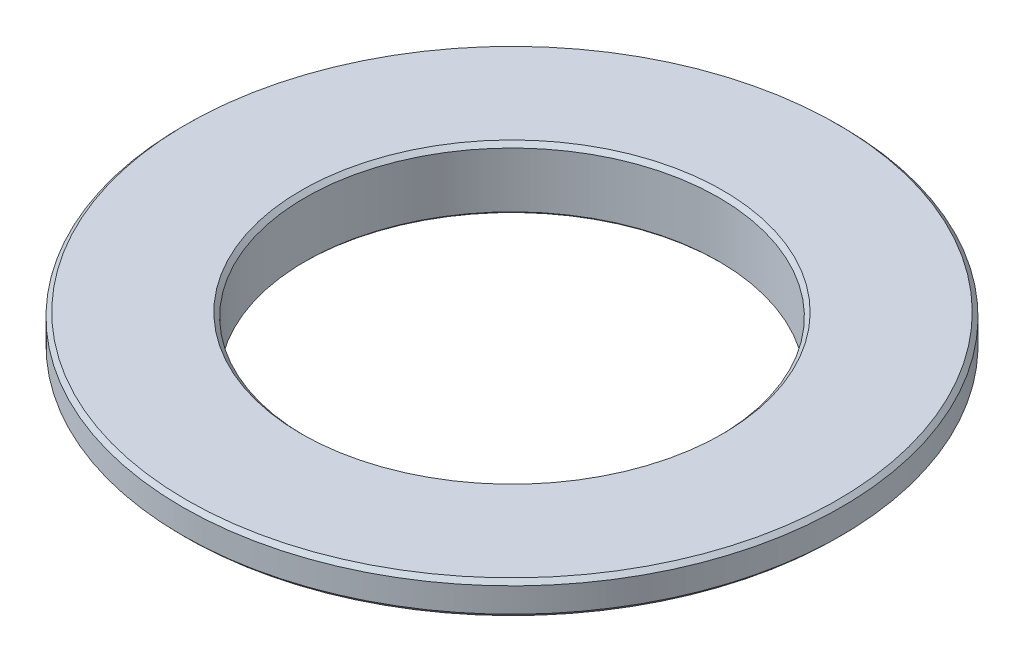
ISO-10303-21;
HEADER;
FILE_DESCRIPTION(('STEP AP214'),'2;1');
FILE_NAME('part.step','',(''),(''),'','','');
FILE_SCHEMA(('AUTOMOTIVE_DESIGN { 1 0 10303 214 1 1 1 1 }'));
ENDSEC;
DATA;
#1=APPLICATION_CONTEXT('core data for automotive mechanical design processes');
#2=APPLICATION_PROTOCOL_DEFINITION('international standard','automotive_design',2000,#1);
#3=PRODUCT_CONTEXT('',#1,'mechanical');
#4=PRODUCT('Part','Part','',(#3));
#5=PRODUCT_RELATED_PRODUCT_CATEGORY('part','',(#4));
#6=PRODUCT_DEFINITION_FORMATION('','',#4);
#7=PRODUCT_DEFINITION_CONTEXT('part definition',#1,'design');
#8=PRODUCT_DEFINITION('design','',#6,#7);
#9=PRODUCT_DEFINITION_SHAPE('','',#8);
#10=(LENGTH_UNIT() NAMED_UNIT(*) SI_UNIT(.MILLI.,.METRE.));
#11=(NAMED_UNIT(*) PLANE_ANGLE_UNIT() SI_UNIT($,.RADIAN.));
#12=(NAMED_UNIT(*) SI_UNIT($,.STERADIAN.) SOLID_ANGLE_UNIT());
#13=UNCERTAINTY_MEASURE_WITH_UNIT(LENGTH_MEASURE(1.E-05),#10,'distance_accuracy_value','');
#14=(GEOMETRIC_REPRESENTATION_CONTEXT(3) GLOBAL_UNCERTAINTY_ASSIGNED_CONTEXT((#13)) GLOBAL_UNIT_ASSIGNED_CONTEXT((#10,
#11,#12)) REPRESENTATION_CONTEXT('',''));
#15=CARTESIAN_POINT('',(0.,0.,0.));
#16=DIRECTION('',(0.,0.,1.));
#17=DIRECTION('',(1.,0.,0.));
#18=AXIS2_PLACEMENT_3D('',#15,#16,#17);
#19=CARTESIAN_POINT('',(0.,19.,0.));
#20=DIRECTION('',(0.,-1.,0.));
#21=DIRECTION('',(0.,0.,-1.));
#22=AXIS2_PLACEMENT_3D('',#19,#20,#21);
#23=CYLINDRICAL_SURFACE('',#22,80.5);
#24=CARTESIAN_POINT('',(0.,17.9999999991025,0.));
#25=DIRECTION('',(0.,1.,0.));
#26=DIRECTION('',(0.,0.,1.));
#27=AXIS2_PLACEMENT_3D('',#24,#25,#26);
#28=CIRCLE('',#27,80.5);
#29=CARTESIAN_POINT('',(0.,17.9999999991025,80.5));
#30=VERTEX_POINT('',#29);
#31=EDGE_CURVE('E58',#30,#30,#28,.F.);
#32=ORIENTED_EDGE('',*,*,#31,.T.);
#33=EDGE_LOOP('',(#32));
#34=FACE_BOUND('',#33,.T.);
#35=CARTESIAN_POINT('',(0.,11.9999999991026,0.));
#36=DIRECTION('',(0.,-1.,0.));
#37=DIRECTION('',(0.,0.,-1.));
#38=AXIS2_PLACEMENT_3D('',#35,#36,#37);
#39=CIRCLE('',#38,80.5);
#40=CARTESIAN_POINT('',(0.,11.9999999991026,-80.5));
#41=VERTEX_POINT('',#40);
#42=EDGE_CURVE('E61',#41,#41,#39,.F.);
#43=ORIENTED_EDGE('',*,*,#42,.T.);
#44=EDGE_LOOP('',(#43));
#45=FACE_BOUND('',#44,.T.);
#46=ADVANCED_FACE('F37',(#34,#45),#23,.T.);
#47=CARTESIAN_POINT('',(80.5,19.,0.));
#48=DIRECTION('',(0.,1.,0.));
#49=DIRECTION('',(0.,0.,1.));
#50=AXIS2_PLACEMENT_3D('',#47,#48,#49);
#51=PLANE('',#50);
#52=CARTESIAN_POINT('',(0.,19.,0.));
#53=DIRECTION('',(0.,1.,0.));
#54=DIRECTION('',(0.,0.,1.));
#55=AXIS2_PLACEMENT_3D('',#52,#53,#54);
#56=CIRCLE('',#55,79.5000000008974);
#57=CARTESIAN_POINT('',(0.,19.,79.5000000008974));
#58=VERTEX_POINT('',#57);
#59=EDGE_CURVE('E49',#58,#58,#56,.T.);
#60=ORIENTED_EDGE('',*,*,#59,.T.);
#61=EDGE_LOOP('',(#60));
#62=FACE_BOUND('',#61,.T.);
#63=CARTESIAN_POINT('',(0.,19.,0.));
#64=DIRECTION('',(0.,1.,0.));
#65=DIRECTION('',(0.,0.,1.));
#66=AXIS2_PLACEMENT_3D('',#63,#64,#65);
#67=CIRCLE('',#66,51.5000000008975);
#68=CARTESIAN_POINT('',(0.,19.,51.5000000008975));
#69=VERTEX_POINT('',#68);
#70=EDGE_CURVE('E53',#69,#69,#67,.F.);
#71=ORIENTED_EDGE('',*,*,#70,.T.);
#72=EDGE_LOOP('',(#71));
#73=FACE_BOUND('',#72,.T.);
#74=ADVANCED_FACE('F84',(#62,#73),#51,.T.);
#75=CARTESIAN_POINT('',(0.,11.,0.));
#76=DIRECTION('',(0.,-1.,0.));
#77=DIRECTION('',(0.,0.,-1.));
#78=AXIS2_PLACEMENT_3D('',#75,#76,#77);
#79=PLANE('',#78);
#80=CARTESIAN_POINT('',(0.,11.,0.));
#81=DIRECTION('',(0.,-1.,0.));
#82=DIRECTION('',(0.,0.,-1.));
#83=AXIS2_PLACEMENT_3D('',#80,#81,#82);
#84=CIRCLE('',#83,79.4999999991025);
#85=CARTESIAN_POINT('',(0.,11.,-79.4999999991025));
#86=VERTEX_POINT('',#85);
#87=EDGE_CURVE('E45',#86,#86,#84,.T.);
#88=ORIENTED_EDGE('',*,*,#87,.T.);
#89=EDGE_LOOP('',(#88));
#90=FACE_BOUND('',#89,.T.);
#91=CARTESIAN_POINT('',(0.,11.,0.));
#92=DIRECTION('',(0.,-1.,0.));
#93=DIRECTION('',(0.,0.,-1.));
#94=AXIS2_PLACEMENT_3D('',#91,#92,#93);
#95=CIRCLE('',#94,65.25);
#96=CARTESIAN_POINT('',(0.,11.,65.25));
#97=VERTEX_POINT('',#96);
#98=EDGE_CURVE('E76',#97,#97,#95,.T.);
#99=ORIENTED_EDGE('',*,*,#98,.F.);
#100=EDGE_LOOP('',(#99));
#101=FACE_BOUND('',#100,.T.);
#102=ADVANCED_FACE('F82',(#90,#101),#79,.T.);
#103=CARTESIAN_POINT('',(0.,4.,0.));
#104=DIRECTION('',(0.,1.,0.));
#105=DIRECTION('',(0.,0.,1.));
#106=AXIS2_PLACEMENT_3D('',#103,#104,#105);
#107=CYLINDRICAL_SURFACE('',#106,65.25);
#108=CARTESIAN_POINT('',(0.,4.499999999551,0.));
#109=DIRECTION('',(0.,-1.,0.));
#110=DIRECTION('',(0.,0.,-1.));
#111=AXIS2_PLACEMENT_3D('',#108,#109,#110);
#112=CIRCLE('',#111,65.25);
#113=CARTESIAN_POINT('',(0.,4.499999999551,65.25));
#114=VERTEX_POINT('',#113);
#115=EDGE_CURVE('E67',#114,#114,#112,.F.);
#116=CARTESIAN_POINT('',(0.,4.499999999551,65.25));
#117=CARTESIAN_POINT('',(0.,4.56770833288901,65.25));
#118=CARTESIAN_POINT('',(0.,4.63541666622702,65.25));
#119=CARTESIAN_POINT('',(0.,4.77083333290304,65.25));
#120=CARTESIAN_POINT('',(0.,4.83854166624105,65.25));
#121=CARTESIAN_POINT('',(0.,4.97395833291707,65.25));
#122=CARTESIAN_POINT('',(0.,5.04166666625508,65.25));
#123=CARTESIAN_POINT('',(0.,5.1770833329311,65.25));
#124=CARTESIAN_POINT('',(0.,5.24479166626911,65.25));
#125=CARTESIAN_POINT('',(0.,5.38020833294514,65.25));
#126=CARTESIAN_POINT('',(0.,5.44791666628314,65.25));
#127=CARTESIAN_POINT('',(0.,5.58333333295917,65.25));
#128=CARTESIAN_POINT('',(0.,5.65104166629718,65.25));
#129=CARTESIAN_POINT('',(0.,5.7864583329732,65.25));
#130=CARTESIAN_POINT('',(0.,5.85416666631121,65.25));
#131=CARTESIAN_POINT('',(0.,5.98958333298723,65.25));
#132=CARTESIAN_POINT('',(0.,6.05729166632524,65.25));
#133=CARTESIAN_POINT('',(0.,6.19270833300126,65.25));
#134=CARTESIAN_POINT('',(0.,6.26041666633927,65.25));
#135=CARTESIAN_POINT('',(0.,6.39583333301529,65.25));
#136=CARTESIAN_POINT('',(0.,6.4635416663533,65.25));
#137=CARTESIAN_POINT('',(0.,6.59895833302932,65.25));
#138=CARTESIAN_POINT('',(0.,6.66666666636733,65.25));
#139=CARTESIAN_POINT('',(0.,6.80208333304335,65.25));
#140=CARTESIAN_POINT('',(0.,6.86979166638136,65.25));
#141=CARTESIAN_POINT('',(0.,7.00520833305738,65.25));
#142=CARTESIAN_POINT('',(0.,7.0729166663954,65.25));
#143=CARTESIAN_POINT('',(0.,7.20833333307142,65.25));
#144=CARTESIAN_POINT('',(0.,7.27604166640943,65.25));
#145=CARTESIAN_POINT('',(0.,7.41145833308545,65.25));
#146=CARTESIAN_POINT('',(0.,7.47916666642346,65.25));
#147=CARTESIAN_POINT('',(0.,7.61458333309948,65.25));
#148=CARTESIAN_POINT('',(0.,7.68229166643749,65.25));
#149=CARTESIAN_POINT('',(0.,7.81770833311351,65.25));
#150=CARTESIAN_POINT('',(0.,7.88541666645152,65.25));
#151=CARTESIAN_POINT('',(0.,8.02083333312754,65.25));
#152=CARTESIAN_POINT('',(0.,8.08854166646555,65.25));
#153=CARTESIAN_POINT('',(0.,8.22395833314157,65.25));
#154=CARTESIAN_POINT('',(0.,8.29166666647958,65.25));
#155=CARTESIAN_POINT('',(0.,8.4270833331556,65.25));
#156=CARTESIAN_POINT('',(0.,8.49479166649361,65.25));
#157=CARTESIAN_POINT('',(0.,8.63020833316963,65.25));
#158=CARTESIAN_POINT('',(0.,8.69791666650765,65.25));
#159=CARTESIAN_POINT('',(0.,8.83333333318367,65.25));
#160=CARTESIAN_POINT('',(0.,8.90104166652168,65.25));
#161=CARTESIAN_POINT('',(0.,9.0364583331977,65.25));
#162=CARTESIAN_POINT('',(0.,9.10416666653571,65.25));
#163=CARTESIAN_POINT('',(0.,9.23958333321173,65.25));
#164=CARTESIAN_POINT('',(0.,9.30729166654974,65.25));
#165=CARTESIAN_POINT('',(0.,9.44270833322576,65.25));
#166=CARTESIAN_POINT('',(0.,9.51041666656377,65.25));
#167=CARTESIAN_POINT('',(0.,9.64583333323979,65.25));
#168=CARTESIAN_POINT('',(0.,9.7135416665778,65.25));
#169=CARTESIAN_POINT('',(0.,9.84895833325382,65.25));
#170=CARTESIAN_POINT('',(0.,9.91666666659183,65.25));
#171=CARTESIAN_POINT('',(0.,10.0520833332679,65.25));
#172=CARTESIAN_POINT('',(0.,10.1197916666059,65.25));
#173=CARTESIAN_POINT('',(0.,10.2552083332819,65.25));
#174=CARTESIAN_POINT('',(0.,10.3229166666199,65.25));
#175=CARTESIAN_POINT('',(0.,10.4583333332959,65.25));
#176=CARTESIAN_POINT('',(0.,10.5260416666339,65.25));
#177=CARTESIAN_POINT('',(0.,10.6614583333099,65.25));
#178=CARTESIAN_POINT('',(0.,10.729166666648,65.25));
#179=CARTESIAN_POINT('',(0.,10.864583333324,65.25));
#180=CARTESIAN_POINT('',(0.,10.932291666662,65.25));
#181=CARTESIAN_POINT('',(0.,11.,65.25));
#182=B_SPLINE_CURVE_WITH_KNOTS('',3,(#116,#117,#118,#119,#120,#121,#122,#123,#124,#125,#126,
#127,#128,#129,#130,#131,#132,#133,#134,#135,#136,#137,#138,#139,#140,#141,#142,#143,#144,#145,
#146,#147,#148,#149,#150,#151,#152,#153,#154,#155,#156,#157,#158,#159,#160,#161,#162,#163,#164,
#165,#166,#167,#168,#169,#170,#171,#172,#173,#174,#175,#176,#177,#178,#179,#180,#181),
.UNSPECIFIED.,.F.,.F.,(4,2,2,2,2,2,2,2,2,2,2,2,2,2,2,2,2,2,2,2,2,2,2,2,2,2,2,2,2,2,2,2,4),(0.,
0.203125000014031,0.406250000028062,0.609375000042094,0.812500000056125,1.01562500007016,
1.21875000008419,1.42187500009822,1.62500000011225,1.82812500012628,2.03125000014031,
2.23437500015434,2.43750000016838,2.64062500018241,2.84375000019644,3.04687500021047,
3.2500000002245,3.45312500023853,3.65625000025256,3.85937500026659,4.06250000028063,
4.26562500029466,4.46875000030869,4.67187500032272,4.87500000033675,5.07812500035078,
5.28125000036481,5.48437500037885,5.68750000039288,5.89062500040691,6.09375000042094,
6.29687500043497,6.500000000449),.UNSPECIFIED.);
#183=EDGE_CURVE('BSEAM80',#114,#97,#182,.T.);
#184=ORIENTED_EDGE('',*,*,#115,.T.);
#185=ORIENTED_EDGE('',*,*,#98,.T.);
#186=ORIENTED_EDGE('',*,*,#183,.T.);
#187=ORIENTED_EDGE('',*,*,#183,.F.);
#188=EDGE_LOOP('',(#184,#186,#185,#187));
#189=FACE_BOUND('',#188,.T.);
#190=ADVANCED_FACE('F80',(#189),#107,.T.);
#191=CARTESIAN_POINT('',(0.,4.,0.));
#192=DIRECTION('',(0.,-1.,0.));
#193=DIRECTION('',(0.,0.,-1.));
#194=AXIS2_PLACEMENT_3D('',#191,#192,#193);
#195=PLANE('',#194);
#196=CARTESIAN_POINT('',(0.,4.,0.));
#197=DIRECTION('',(0.,-1.,0.));
#198=DIRECTION('',(0.,0.,-1.));
#199=AXIS2_PLACEMENT_3D('',#196,#197,#198);
#200=CIRCLE('',#199,64.7499999995515);
#201=CARTESIAN_POINT('',(0.,4.,-64.7499999995515));
#202=VERTEX_POINT('',#201);
#203=EDGE_CURVE('E70',#202,#202,#200,.T.);
#204=ORIENTED_EDGE('',*,*,#203,.T.);
#205=EDGE_LOOP('',(#204));
#206=FACE_BOUND('',#205,.T.);
#207=CARTESIAN_POINT('',(0.,4.,0.));
#208=DIRECTION('',(0.,-1.,0.));
#209=DIRECTION('',(0.,0.,-1.));
#210=AXIS2_PLACEMENT_3D('',#207,#208,#209);
#211=CIRCLE('',#210,50.9999999995512);
#212=CARTESIAN_POINT('',(0.,4.,-50.9999999995512));
#213=VERTEX_POINT('',#212);
#214=EDGE_CURVE('E73',#213,#213,#211,.F.);
#215=ORIENTED_EDGE('',*,*,#214,.T.);
#216=EDGE_LOOP('',(#215));
#217=FACE_BOUND('',#216,.T.);
#218=ADVANCED_FACE('F90',(#206,#217),#195,.T.);
#219=CARTESIAN_POINT('',(0.,4.,0.));
#220=DIRECTION('',(0.,-1.,0.));
#221=DIRECTION('',(0.,0.,-1.));
#222=AXIS2_PLACEMENT_3D('',#219,#220,#221);
#223=CYLINDRICAL_SURFACE('',#222,50.5);
#224=CARTESIAN_POINT('',(0.,18.0000000008974,0.));
#225=DIRECTION('',(0.,1.,0.));
#226=DIRECTION('',(0.,0.,1.));
#227=AXIS2_PLACEMENT_3D('',#224,#225,#226);
#228=CIRCLE('',#227,50.5);
#229=CARTESIAN_POINT('',(0.,18.0000000008974,50.5));
#230=VERTEX_POINT('',#229);
#231=EDGE_CURVE('E10',#230,#230,#228,.T.);
#232=ORIENTED_EDGE('',*,*,#231,.T.);
#233=EDGE_LOOP('',(#232));
#234=FACE_BOUND('',#233,.T.);
#235=CARTESIAN_POINT('',(0.,4.50000000044859,0.));
#236=DIRECTION('',(0.,-1.,0.));
#237=DIRECTION('',(0.,0.,-1.));
#238=AXIS2_PLACEMENT_3D('',#235,#236,#237);
#239=CIRCLE('',#238,50.5);
#240=CARTESIAN_POINT('',(0.,4.50000000044859,-50.5));
#241=VERTEX_POINT('',#240);
#242=EDGE_CURVE('E64',#241,#241,#239,.T.);
#243=ORIENTED_EDGE('',*,*,#242,.T.);
#244=EDGE_LOOP('',(#243));
#245=FACE_BOUND('',#244,.T.);
#246=ADVANCED_FACE('F110',(#234,#245),#223,.F.);
#247=CARTESIAN_POINT('',(0.,4.,0.));
#248=DIRECTION('',(0.,1.,0.));
#249=DIRECTION('',(0.,0.,1.));
#250=AXIS2_PLACEMENT_3D('',#247,#248,#249);
#251=CONICAL_SURFACE('',#250,64.7499999995515,0.785398164294911);
#252=ORIENTED_EDGE('',*,*,#115,.F.);
#253=EDGE_LOOP('',(#252));
#254=FACE_BOUND('',#253,.T.);
#255=ORIENTED_EDGE('',*,*,#203,.F.);
#256=EDGE_LOOP('',(#255));
#257=FACE_BOUND('',#256,.T.);
#258=ADVANCED_FACE('F103',(#254,#257),#251,.T.);
#259=CARTESIAN_POINT('',(0.,4.50000000044859,0.));
#260=DIRECTION('',(0.,-1.,0.));
#261=DIRECTION('',(0.,0.,-1.));
#262=AXIS2_PLACEMENT_3D('',#259,#260,#261);
#263=CONICAL_SURFACE('',#262,50.5,0.785398162500027);
#264=ORIENTED_EDGE('',*,*,#214,.F.);
#265=EDGE_LOOP('',(#264));
#266=FACE_BOUND('',#265,.T.);
#267=ORIENTED_EDGE('',*,*,#242,.F.);
#268=EDGE_LOOP('',(#267));
#269=FACE_BOUND('',#268,.T.);
#270=ADVANCED_FACE('F109',(#266,#269),#263,.F.);
#271=CARTESIAN_POINT('',(0.,17.9999999991025,0.));
#272=DIRECTION('',(0.,-1.,0.));
#273=DIRECTION('',(0.,0.,-1.));
#274=AXIS2_PLACEMENT_3D('',#271,#272,#273);
#275=CONICAL_SURFACE('',#274,80.5,0.785398162500013);
#276=ORIENTED_EDGE('',*,*,#59,.F.);
#277=EDGE_LOOP('',(#276));
#278=FACE_BOUND('',#277,.T.);
#279=ORIENTED_EDGE('',*,*,#31,.F.);
#280=EDGE_LOOP('',(#279));
#281=FACE_BOUND('',#280,.T.);
#282=ADVANCED_FACE('F117',(#278,#281),#275,.T.);
#283=CARTESIAN_POINT('',(0.,11.,0.));
#284=DIRECTION('',(0.,1.,0.));
#285=DIRECTION('',(0.,0.,1.));
#286=AXIS2_PLACEMENT_3D('',#283,#284,#285);
#287=CONICAL_SURFACE('',#286,79.4999999991025,0.785398164294904);
#288=ORIENTED_EDGE('',*,*,#42,.F.);
#289=EDGE_LOOP('',(#288));
#290=FACE_BOUND('',#289,.T.);
#291=ORIENTED_EDGE('',*,*,#87,.F.);
#292=EDGE_LOOP('',(#291));
#293=FACE_BOUND('',#292,.T.);
#294=ADVANCED_FACE('F123',(#290,#293),#287,.T.);
#295=CARTESIAN_POINT('',(0.,19.,0.));
#296=DIRECTION('',(0.,1.,0.));
#297=DIRECTION('',(0.,0.,1.));
#298=AXIS2_PLACEMENT_3D('',#295,#296,#297);
#299=CONICAL_SURFACE('',#298,51.5000000008975,0.785398164294897);
#300=ORIENTED_EDGE('',*,*,#231,.F.);
#301=EDGE_LOOP('',(#300));
#302=FACE_BOUND('',#301,.T.);
#303=ORIENTED_EDGE('',*,*,#70,.F.);
#304=EDGE_LOOP('',(#303));
#305=FACE_BOUND('',#304,.T.);
#306=ADVANCED_FACE('F40',(#302,#305),#299,.F.);
#307=CLOSED_SHELL('',(#46,#74,#102,#190,#218,#246,#258,#270,#282,#294,#306));
#308=MANIFOLD_SOLID_BREP('B2',#307);
#309=ADVANCED_BREP_SHAPE_REPRESENTATION('',(#18,#308),#14);
#310=SHAPE_DEFINITION_REPRESENTATION(#9,#309);
ENDSEC;
END-ISO-10303-21;
